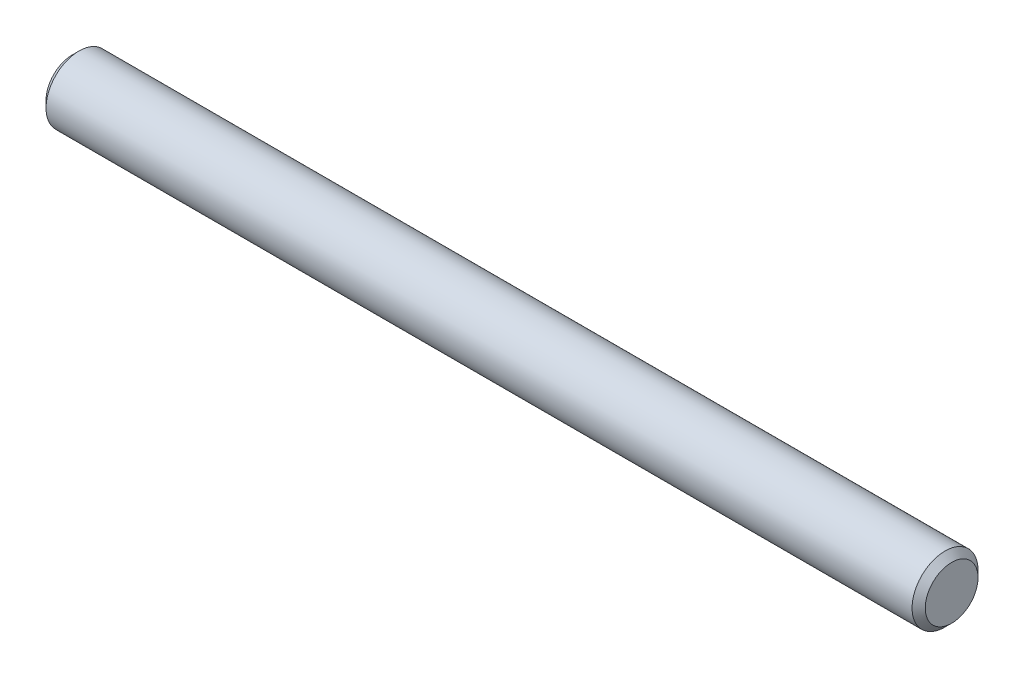
ISO-10303-21;
HEADER;
FILE_DESCRIPTION(('STEP AP214'),'2;1');
FILE_NAME('part.step','',(''),(''),'','','');
FILE_SCHEMA(('AUTOMOTIVE_DESIGN { 1 0 10303 214 1 1 1 1 }'));
ENDSEC;
DATA;
#1=APPLICATION_CONTEXT('core data for automotive mechanical design processes');
#2=APPLICATION_PROTOCOL_DEFINITION('international standard','automotive_design',2000,#1);
#3=PRODUCT_CONTEXT('',#1,'mechanical');
#4=PRODUCT('Part','Part','',(#3));
#5=PRODUCT_RELATED_PRODUCT_CATEGORY('part','',(#4));
#6=PRODUCT_DEFINITION_FORMATION('','',#4);
#7=PRODUCT_DEFINITION_CONTEXT('part definition',#1,'design');
#8=PRODUCT_DEFINITION('design','',#6,#7);
#9=PRODUCT_DEFINITION_SHAPE('','',#8);
#10=(LENGTH_UNIT() NAMED_UNIT(*) SI_UNIT(.MILLI.,.METRE.));
#11=(NAMED_UNIT(*) PLANE_ANGLE_UNIT() SI_UNIT($,.RADIAN.));
#12=(NAMED_UNIT(*) SI_UNIT($,.STERADIAN.) SOLID_ANGLE_UNIT());
#13=UNCERTAINTY_MEASURE_WITH_UNIT(LENGTH_MEASURE(1.E-05),#10,'distance_accuracy_value','');
#14=(GEOMETRIC_REPRESENTATION_CONTEXT(3) GLOBAL_UNCERTAINTY_ASSIGNED_CONTEXT((#13)) GLOBAL_UNIT_ASSIGNED_CONTEXT((#10,
#11,#12)) REPRESENTATION_CONTEXT('',''));
#15=CARTESIAN_POINT('',(0.,0.,0.));
#16=DIRECTION('',(0.,0.,1.));
#17=DIRECTION('',(1.,0.,0.));
#18=AXIS2_PLACEMENT_3D('',#15,#16,#17);
#19=CARTESIAN_POINT('',(-31.75,0.,0.));
#20=DIRECTION('',(1.,0.,0.));
#21=DIRECTION('',(0.,0.,-1.));
#22=AXIS2_PLACEMENT_3D('',#19,#20,#21);
#23=CYLINDRICAL_SURFACE('',#22,2.38125);
#24=CARTESIAN_POINT('',(31.27375,0.,0.));
#25=DIRECTION('',(1.,0.,0.));
#26=DIRECTION('',(0.,0.,-1.));
#27=AXIS2_PLACEMENT_3D('',#24,#25,#26);
#28=CIRCLE('',#27,2.38125);
#29=CARTESIAN_POINT('',(31.27375,0.,-2.38125));
#30=VERTEX_POINT('',#29);
#31=EDGE_CURVE('E53',#30,#30,#28,.F.);
#32=ORIENTED_EDGE('',*,*,#31,.T.);
#33=EDGE_LOOP('',(#32));
#34=FACE_BOUND('',#33,.T.);
#35=CARTESIAN_POINT('',(-31.27375,0.,0.));
#36=DIRECTION('',(1.,0.,0.));
#37=DIRECTION('',(0.,0.,-1.));
#38=AXIS2_PLACEMENT_3D('',#35,#36,#37);
#39=CIRCLE('',#38,2.38125);
#40=CARTESIAN_POINT('',(-31.27375,0.,-2.38125));
#41=VERTEX_POINT('',#40);
#42=EDGE_CURVE('E57',#41,#41,#39,.T.);
#43=ORIENTED_EDGE('',*,*,#42,.T.);
#44=EDGE_LOOP('',(#43));
#45=FACE_BOUND('',#44,.T.);
#46=ADVANCED_FACE('F46',(#34,#45),#23,.T.);
#47=CARTESIAN_POINT('',(-31.75,0.,0.));
#48=DIRECTION('',(1.,0.,0.));
#49=DIRECTION('',(0.,0.,-1.));
#50=AXIS2_PLACEMENT_3D('',#47,#48,#49);
#51=PLANE('',#50);
#52=CARTESIAN_POINT('',(-31.75,0.,0.));
#53=DIRECTION('',(1.,0.,0.));
#54=DIRECTION('',(0.,0.,-1.));
#55=AXIS2_PLACEMENT_3D('',#52,#53,#54);
#56=CIRCLE('',#55,1.90499999999998);
#57=CARTESIAN_POINT('',(-31.75,0.,-1.90499999999998));
#58=VERTEX_POINT('',#57);
#59=EDGE_CURVE('E12',#58,#58,#56,.F.);
#60=ORIENTED_EDGE('',*,*,#59,.T.);
#61=EDGE_LOOP('',(#60));
#62=FACE_BOUND('',#61,.T.);
#63=ADVANCED_FACE('F77',(#62),#51,.F.);
#64=CARTESIAN_POINT('',(31.75,0.,0.));
#65=DIRECTION('',(1.,0.,0.));
#66=DIRECTION('',(0.,0.,-1.));
#67=AXIS2_PLACEMENT_3D('',#64,#65,#66);
#68=PLANE('',#67);
#69=CARTESIAN_POINT('',(31.75,0.,0.));
#70=DIRECTION('',(1.,0.,0.));
#71=DIRECTION('',(0.,0.,-1.));
#72=AXIS2_PLACEMENT_3D('',#69,#70,#71);
#73=CIRCLE('',#72,1.90500000000001);
#74=CARTESIAN_POINT('',(31.75,0.,-1.90500000000001));
#75=VERTEX_POINT('',#74);
#76=EDGE_CURVE('E61',#75,#75,#73,.T.);
#77=ORIENTED_EDGE('',*,*,#76,.T.);
#78=EDGE_LOOP('',(#77));
#79=FACE_BOUND('',#78,.T.);
#80=ADVANCED_FACE('F67',(#79),#68,.T.);
#81=CARTESIAN_POINT('',(31.75,0.,0.));
#82=DIRECTION('',(-1.,0.,0.));
#83=DIRECTION('',(0.,0.,1.));
#84=AXIS2_PLACEMENT_3D('',#81,#82,#83);
#85=CONICAL_SURFACE('',#84,1.90500000000001,0.785398163397454);
#86=ORIENTED_EDGE('',*,*,#31,.F.);
#87=EDGE_LOOP('',(#86));
#88=FACE_BOUND('',#87,.T.);
#89=ORIENTED_EDGE('',*,*,#76,.F.);
#90=EDGE_LOOP('',(#89));
#91=FACE_BOUND('',#90,.T.);
#92=ADVANCED_FACE('F69',(#88,#91),#85,.T.);
#93=CARTESIAN_POINT('',(-31.27375,0.,0.));
#94=DIRECTION('',(1.,0.,0.));
#95=DIRECTION('',(0.,0.,-1.));
#96=AXIS2_PLACEMENT_3D('',#93,#94,#95);
#97=CONICAL_SURFACE('',#96,2.38125,0.785398163397447);
#98=ORIENTED_EDGE('',*,*,#59,.F.);
#99=EDGE_LOOP('',(#98));
#100=FACE_BOUND('',#99,.T.);
#101=ORIENTED_EDGE('',*,*,#42,.F.);
#102=EDGE_LOOP('',(#101));
#103=FACE_BOUND('',#102,.T.);
#104=ADVANCED_FACE('F48',(#100,#103),#97,.T.);
#105=CLOSED_SHELL('',(#46,#63,#80,#92,#104));
#106=MANIFOLD_SOLID_BREP('B2',#105);
#107=ADVANCED_BREP_SHAPE_REPRESENTATION('',(#18,#106),#14);
#108=SHAPE_DEFINITION_REPRESENTATION(#9,#107);
ENDSEC;
END-ISO-10303-21;
